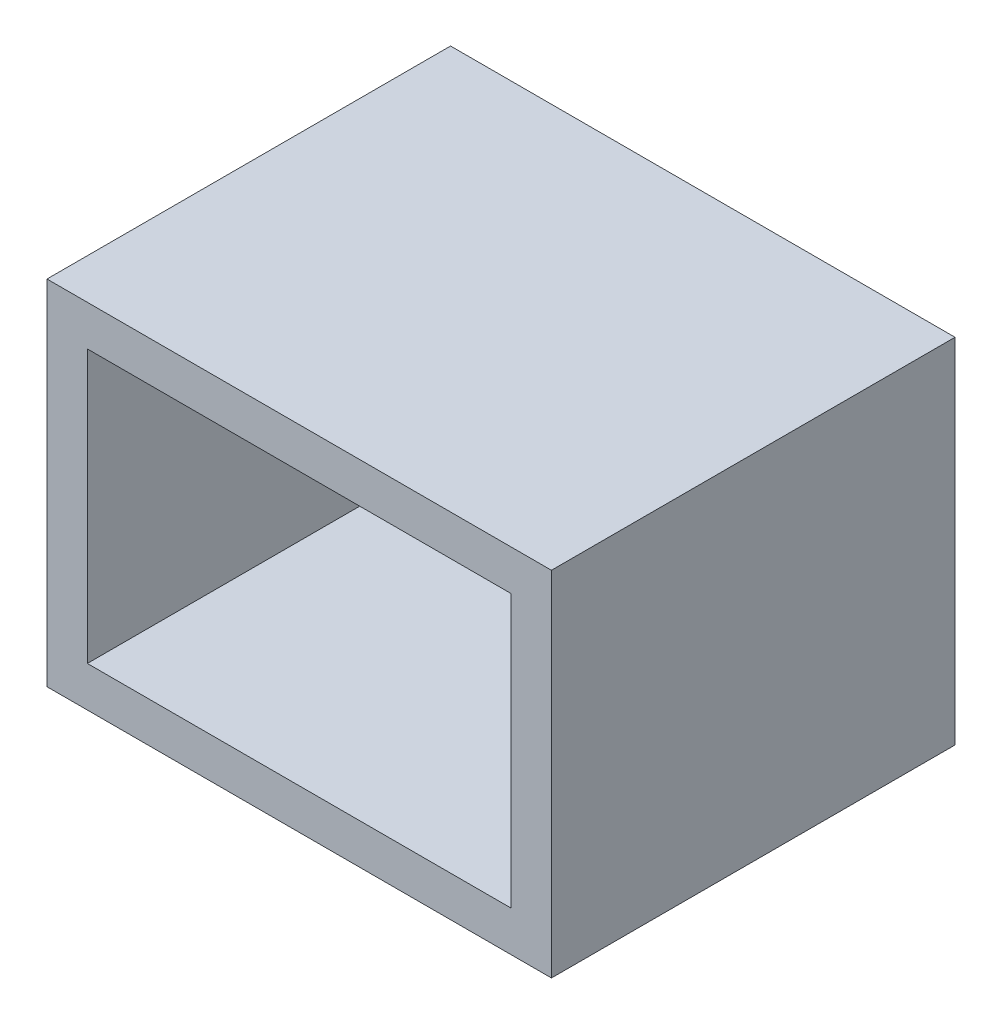
ISO-10303-21;
HEADER;
FILE_DESCRIPTION(('STEP AP214'),'2;1');
FILE_NAME('part.step','',(''),(''),'','','');
FILE_SCHEMA(('AUTOMOTIVE_DESIGN { 1 0 10303 214 1 1 1 1 }'));
ENDSEC;
DATA;
#1=APPLICATION_CONTEXT('core data for automotive mechanical design processes');
#2=APPLICATION_PROTOCOL_DEFINITION('international standard','automotive_design',2000,#1);
#3=PRODUCT_CONTEXT('',#1,'mechanical');
#4=PRODUCT('Part','Part','',(#3));
#5=PRODUCT_RELATED_PRODUCT_CATEGORY('part','',(#4));
#6=PRODUCT_DEFINITION_FORMATION('','',#4);
#7=PRODUCT_DEFINITION_CONTEXT('part definition',#1,'design');
#8=PRODUCT_DEFINITION('design','',#6,#7);
#9=PRODUCT_DEFINITION_SHAPE('','',#8);
#10=(LENGTH_UNIT() NAMED_UNIT(*) SI_UNIT(.MILLI.,.METRE.));
#11=(NAMED_UNIT(*) PLANE_ANGLE_UNIT() SI_UNIT($,.RADIAN.));
#12=(NAMED_UNIT(*) SI_UNIT($,.STERADIAN.) SOLID_ANGLE_UNIT());
#13=UNCERTAINTY_MEASURE_WITH_UNIT(LENGTH_MEASURE(1.E-05),#10,'distance_accuracy_value','');
#14=(GEOMETRIC_REPRESENTATION_CONTEXT(3) GLOBAL_UNCERTAINTY_ASSIGNED_CONTEXT((#13)) GLOBAL_UNIT_ASSIGNED_CONTEXT((#10,
#11,#12)) REPRESENTATION_CONTEXT('',''));
#15=CARTESIAN_POINT('',(0.,0.,0.));
#16=DIRECTION('',(0.,0.,1.));
#17=DIRECTION('',(1.,0.,0.));
#18=AXIS2_PLACEMENT_3D('',#15,#16,#17);
#19=CARTESIAN_POINT('',(25.,35.,-20.));
#20=DIRECTION('',(-1.,0.,0.));
#21=DIRECTION('',(0.,0.,1.));
#22=AXIS2_PLACEMENT_3D('',#19,#20,#21);
#23=PLANE('',#22);
#24=DIRECTION('',(0.,0.,-1.));
#25=VECTOR('',#24,1.);
#26=CARTESIAN_POINT('',(25.,0.,-20.));
#27=LINE('',#26,#25);
#28=CARTESIAN_POINT('',(25.,0.,20.));
#29=VERTEX_POINT('',#28);
#30=CARTESIAN_POINT('',(25.,0.,-20.));
#31=VERTEX_POINT('',#30);
#32=EDGE_CURVE('E134',#29,#31,#27,.T.);
#33=ORIENTED_EDGE('',*,*,#32,.T.);
#34=DIRECTION('',(0.,-1.,0.));
#35=VECTOR('',#34,1.);
#36=CARTESIAN_POINT('',(25.,35.,-20.));
#37=LINE('',#36,#35);
#38=CARTESIAN_POINT('',(25.,35.,-20.));
#39=VERTEX_POINT('',#38);
#40=EDGE_CURVE('E11',#39,#31,#37,.T.);
#41=ORIENTED_EDGE('',*,*,#40,.F.);
#42=DIRECTION('',(0.,0.,-1.));
#43=VECTOR('',#42,1.);
#44=CARTESIAN_POINT('',(25.,35.,-20.));
#45=LINE('',#44,#43);
#46=CARTESIAN_POINT('',(25.,35.,20.));
#47=VERTEX_POINT('',#46);
#48=EDGE_CURVE('E138',#47,#39,#45,.T.);
#49=ORIENTED_EDGE('',*,*,#48,.F.);
#50=DIRECTION('',(0.,-1.,0.));
#51=VECTOR('',#50,1.);
#52=CARTESIAN_POINT('',(25.,35.,20.));
#53=LINE('',#52,#51);
#54=EDGE_CURVE('E148',#47,#29,#53,.T.);
#55=ORIENTED_EDGE('',*,*,#54,.T.);
#56=EDGE_LOOP('',(#33,#41,#49,#55));
#57=FACE_BOUND('',#56,.T.);
#58=ADVANCED_FACE('F37',(#57),#23,.F.);
#59=CARTESIAN_POINT('',(-25.,35.,-20.));
#60=DIRECTION('',(0.,0.,1.));
#61=DIRECTION('',(1.,0.,0.));
#62=AXIS2_PLACEMENT_3D('',#59,#60,#61);
#63=PLANE('',#62);
#64=DIRECTION('',(0.,1.,0.));
#65=VECTOR('',#64,1.);
#66=CARTESIAN_POINT('',(21.,4.,-20.));
#67=LINE('',#66,#65);
#68=CARTESIAN_POINT('',(21.,4.,-20.));
#69=VERTEX_POINT('',#68);
#70=CARTESIAN_POINT('',(21.,31.,-20.));
#71=VERTEX_POINT('',#70);
#72=EDGE_CURVE('E109',#69,#71,#67,.T.);
#73=ORIENTED_EDGE('',*,*,#72,.T.);
#74=DIRECTION('',(-1.,0.,0.));
#75=VECTOR('',#74,1.);
#76=CARTESIAN_POINT('',(21.,31.,-20.));
#77=LINE('',#76,#75);
#78=CARTESIAN_POINT('',(-21.,31.,-20.));
#79=VERTEX_POINT('',#78);
#80=EDGE_CURVE('E103',#71,#79,#77,.T.);
#81=ORIENTED_EDGE('',*,*,#80,.T.);
#82=DIRECTION('',(0.,-1.,0.));
#83=VECTOR('',#82,1.);
#84=CARTESIAN_POINT('',(-21.,31.,-20.));
#85=LINE('',#84,#83);
#86=CARTESIAN_POINT('',(-21.,4.,-20.));
#87=VERTEX_POINT('',#86);
#88=EDGE_CURVE('E112',#79,#87,#85,.T.);
#89=ORIENTED_EDGE('',*,*,#88,.T.);
#90=DIRECTION('',(1.,0.,0.));
#91=VECTOR('',#90,1.);
#92=CARTESIAN_POINT('',(-21.,4.,-20.));
#93=LINE('',#92,#91);
#94=EDGE_CURVE('E51',#87,#69,#93,.T.);
#95=ORIENTED_EDGE('',*,*,#94,.T.);
#96=EDGE_LOOP('',(#73,#81,#89,#95));
#97=FACE_BOUND('',#96,.T.);
#98=DIRECTION('',(-1.,0.,0.));
#99=VECTOR('',#98,1.);
#100=CARTESIAN_POINT('',(-25.,0.,-20.));
#101=LINE('',#100,#99);
#102=CARTESIAN_POINT('',(-25.,0.,-20.));
#103=VERTEX_POINT('',#102);
#104=EDGE_CURVE('E151',#31,#103,#101,.T.);
#105=ORIENTED_EDGE('',*,*,#104,.T.);
#106=DIRECTION('',(0.,-1.,0.));
#107=VECTOR('',#106,1.);
#108=CARTESIAN_POINT('',(-25.,35.,-20.));
#109=LINE('',#108,#107);
#110=CARTESIAN_POINT('',(-25.,35.,-20.));
#111=VERTEX_POINT('',#110);
#112=EDGE_CURVE('E44',#111,#103,#109,.T.);
#113=ORIENTED_EDGE('',*,*,#112,.F.);
#114=DIRECTION('',(-1.,0.,0.));
#115=VECTOR('',#114,1.);
#116=CARTESIAN_POINT('',(-25.,35.,-20.));
#117=LINE('',#116,#115);
#118=EDGE_CURVE('E141',#39,#111,#117,.T.);
#119=ORIENTED_EDGE('',*,*,#118,.F.);
#120=ORIENTED_EDGE('',*,*,#40,.T.);
#121=EDGE_LOOP('',(#105,#113,#119,#120));
#122=FACE_BOUND('',#121,.T.);
#123=ADVANCED_FACE('F116',(#97,#122),#63,.F.);
#124=CARTESIAN_POINT('',(-25.,35.,-20.));
#125=DIRECTION('',(1.,0.,0.));
#126=DIRECTION('',(0.,0.,-1.));
#127=AXIS2_PLACEMENT_3D('',#124,#125,#126);
#128=PLANE('',#127);
#129=DIRECTION('',(0.,0.,1.));
#130=VECTOR('',#129,1.);
#131=CARTESIAN_POINT('',(-25.,0.,-20.));
#132=LINE('',#131,#130);
#133=CARTESIAN_POINT('',(-25.,0.,20.));
#134=VERTEX_POINT('',#133);
#135=EDGE_CURVE('E153',#103,#134,#132,.T.);
#136=ORIENTED_EDGE('',*,*,#135,.T.);
#137=DIRECTION('',(0.,-1.,0.));
#138=VECTOR('',#137,1.);
#139=CARTESIAN_POINT('',(-25.,35.,20.));
#140=LINE('',#139,#138);
#141=CARTESIAN_POINT('',(-25.,35.,20.));
#142=VERTEX_POINT('',#141);
#143=EDGE_CURVE('E158',#142,#134,#140,.T.);
#144=ORIENTED_EDGE('',*,*,#143,.F.);
#145=DIRECTION('',(0.,0.,1.));
#146=VECTOR('',#145,1.);
#147=CARTESIAN_POINT('',(-25.,35.,-20.));
#148=LINE('',#147,#146);
#149=EDGE_CURVE('E144',#111,#142,#148,.T.);
#150=ORIENTED_EDGE('',*,*,#149,.F.);
#151=ORIENTED_EDGE('',*,*,#112,.T.);
#152=EDGE_LOOP('',(#136,#144,#150,#151));
#153=FACE_BOUND('',#152,.T.);
#154=ADVANCED_FACE('F165',(#153),#128,.F.);
#155=CARTESIAN_POINT('',(-25.,35.,20.));
#156=DIRECTION('',(0.,0.,-1.));
#157=DIRECTION('',(-1.,0.,0.));
#158=AXIS2_PLACEMENT_3D('',#155,#156,#157);
#159=PLANE('',#158);
#160=DIRECTION('',(0.,-1.,0.));
#161=VECTOR('',#160,1.);
#162=CARTESIAN_POINT('',(-21.,31.,20.));
#163=LINE('',#162,#161);
#164=CARTESIAN_POINT('',(-21.,31.,20.));
#165=VERTEX_POINT('',#164);
#166=CARTESIAN_POINT('',(-21.,4.,20.));
#167=VERTEX_POINT('',#166);
#168=EDGE_CURVE('E128',#165,#167,#163,.T.);
#169=ORIENTED_EDGE('',*,*,#168,.F.);
#170=DIRECTION('',(-1.,0.,0.));
#171=VECTOR('',#170,1.);
#172=CARTESIAN_POINT('',(21.,31.,20.));
#173=LINE('',#172,#171);
#174=CARTESIAN_POINT('',(21.,31.,20.));
#175=VERTEX_POINT('',#174);
#176=EDGE_CURVE('E59',#175,#165,#173,.T.);
#177=ORIENTED_EDGE('',*,*,#176,.F.);
#178=DIRECTION('',(0.,1.,0.));
#179=VECTOR('',#178,1.);
#180=CARTESIAN_POINT('',(21.,4.,20.));
#181=LINE('',#180,#179);
#182=CARTESIAN_POINT('',(21.,4.,20.));
#183=VERTEX_POINT('',#182);
#184=EDGE_CURVE('E119',#183,#175,#181,.T.);
#185=ORIENTED_EDGE('',*,*,#184,.F.);
#186=DIRECTION('',(1.,0.,0.));
#187=VECTOR('',#186,1.);
#188=CARTESIAN_POINT('',(-21.,4.,20.));
#189=LINE('',#188,#187);
#190=EDGE_CURVE('E122',#167,#183,#189,.T.);
#191=ORIENTED_EDGE('',*,*,#190,.F.);
#192=EDGE_LOOP('',(#169,#177,#185,#191));
#193=FACE_BOUND('',#192,.T.);
#194=DIRECTION('',(1.,0.,0.));
#195=VECTOR('',#194,1.);
#196=CARTESIAN_POINT('',(-25.,0.,20.));
#197=LINE('',#196,#195);
#198=EDGE_CURVE('E142',#134,#29,#197,.T.);
#199=ORIENTED_EDGE('',*,*,#198,.T.);
#200=ORIENTED_EDGE('',*,*,#54,.F.);
#201=DIRECTION('',(1.,0.,0.));
#202=VECTOR('',#201,1.);
#203=CARTESIAN_POINT('',(-25.,35.,20.));
#204=LINE('',#203,#202);
#205=EDGE_CURVE('E146',#142,#47,#204,.T.);
#206=ORIENTED_EDGE('',*,*,#205,.F.);
#207=ORIENTED_EDGE('',*,*,#143,.T.);
#208=EDGE_LOOP('',(#199,#200,#206,#207));
#209=FACE_BOUND('',#208,.T.);
#210=ADVANCED_FACE('F173',(#193,#209),#159,.F.);
#211=CARTESIAN_POINT('',(0.,35.,0.));
#212=DIRECTION('',(0.,1.,0.));
#213=DIRECTION('',(0.,0.,1.));
#214=AXIS2_PLACEMENT_3D('',#211,#212,#213);
#215=PLANE('',#214);
#216=ORIENTED_EDGE('',*,*,#48,.T.);
#217=ORIENTED_EDGE('',*,*,#118,.T.);
#218=ORIENTED_EDGE('',*,*,#149,.T.);
#219=ORIENTED_EDGE('',*,*,#205,.T.);
#220=EDGE_LOOP('',(#216,#217,#218,#219));
#221=FACE_BOUND('',#220,.T.);
#222=ADVANCED_FACE('F179',(#221),#215,.T.);
#223=CARTESIAN_POINT('',(0.,0.,0.));
#224=DIRECTION('',(0.,1.,0.));
#225=DIRECTION('',(0.,0.,1.));
#226=AXIS2_PLACEMENT_3D('',#223,#224,#225);
#227=PLANE('',#226);
#228=ORIENTED_EDGE('',*,*,#32,.F.);
#229=ORIENTED_EDGE('',*,*,#198,.F.);
#230=ORIENTED_EDGE('',*,*,#135,.F.);
#231=ORIENTED_EDGE('',*,*,#104,.F.);
#232=EDGE_LOOP('',(#228,#229,#230,#231));
#233=FACE_BOUND('',#232,.T.);
#234=ADVANCED_FACE('F170',(#233),#227,.F.);
#235=CARTESIAN_POINT('',(21.,31.,-20.));
#236=DIRECTION('',(0.,1.,0.));
#237=DIRECTION('',(-1.,0.,0.));
#238=AXIS2_PLACEMENT_3D('',#235,#236,#237);
#239=PLANE('',#238);
#240=ORIENTED_EDGE('',*,*,#176,.T.);
#241=DIRECTION('',(0.,0.,1.));
#242=VECTOR('',#241,1.);
#243=CARTESIAN_POINT('',(-21.,31.,-20.));
#244=LINE('',#243,#242);
#245=EDGE_CURVE('E99',#79,#165,#244,.T.);
#246=ORIENTED_EDGE('',*,*,#245,.F.);
#247=ORIENTED_EDGE('',*,*,#80,.F.);
#248=DIRECTION('',(0.,0.,1.));
#249=VECTOR('',#248,1.);
#250=CARTESIAN_POINT('',(21.,31.,-20.));
#251=LINE('',#250,#249);
#252=EDGE_CURVE('E132',#71,#175,#251,.T.);
#253=ORIENTED_EDGE('',*,*,#252,.T.);
#254=EDGE_LOOP('',(#240,#246,#247,#253));
#255=FACE_BOUND('',#254,.T.);
#256=ADVANCED_FACE('F101',(#255),#239,.F.);
#257=CARTESIAN_POINT('',(21.,4.,-20.));
#258=DIRECTION('',(1.,0.,0.));
#259=DIRECTION('',(0.,1.,0.));
#260=AXIS2_PLACEMENT_3D('',#257,#258,#259);
#261=PLANE('',#260);
#262=ORIENTED_EDGE('',*,*,#184,.T.);
#263=ORIENTED_EDGE('',*,*,#252,.F.);
#264=ORIENTED_EDGE('',*,*,#72,.F.);
#265=DIRECTION('',(0.,0.,1.));
#266=VECTOR('',#265,1.);
#267=CARTESIAN_POINT('',(21.,4.,-20.));
#268=LINE('',#267,#266);
#269=EDGE_CURVE('E135',#69,#183,#268,.T.);
#270=ORIENTED_EDGE('',*,*,#269,.T.);
#271=EDGE_LOOP('',(#262,#263,#264,#270));
#272=FACE_BOUND('',#271,.T.);
#273=ADVANCED_FACE('F196',(#272),#261,.F.);
#274=CARTESIAN_POINT('',(-21.,4.,-20.));
#275=DIRECTION('',(0.,-1.,0.));
#276=DIRECTION('',(0.,0.,-1.));
#277=AXIS2_PLACEMENT_3D('',#274,#275,#276);
#278=PLANE('',#277);
#279=ORIENTED_EDGE('',*,*,#190,.T.);
#280=ORIENTED_EDGE('',*,*,#269,.F.);
#281=ORIENTED_EDGE('',*,*,#94,.F.);
#282=DIRECTION('',(0.,0.,1.));
#283=VECTOR('',#282,1.);
#284=CARTESIAN_POINT('',(-21.,4.,-20.));
#285=LINE('',#284,#283);
#286=EDGE_CURVE('E108',#87,#167,#285,.T.);
#287=ORIENTED_EDGE('',*,*,#286,.T.);
#288=EDGE_LOOP('',(#279,#280,#281,#287));
#289=FACE_BOUND('',#288,.T.);
#290=ADVANCED_FACE('F199',(#289),#278,.F.);
#291=CARTESIAN_POINT('',(-21.,31.,-20.));
#292=DIRECTION('',(-1.,0.,0.));
#293=DIRECTION('',(0.,-1.,0.));
#294=AXIS2_PLACEMENT_3D('',#291,#292,#293);
#295=PLANE('',#294);
#296=ORIENTED_EDGE('',*,*,#168,.T.);
#297=ORIENTED_EDGE('',*,*,#286,.F.);
#298=ORIENTED_EDGE('',*,*,#88,.F.);
#299=ORIENTED_EDGE('',*,*,#245,.T.);
#300=EDGE_LOOP('',(#296,#297,#298,#299));
#301=FACE_BOUND('',#300,.T.);
#302=ADVANCED_FACE('F113',(#301),#295,.F.);
#303=CLOSED_SHELL('',(#58,#123,#154,#210,#222,#234,#256,#273,#290,#302));
#304=MANIFOLD_SOLID_BREP('B2',#303);
#305=ADVANCED_BREP_SHAPE_REPRESENTATION('',(#18,#304),#14);
#306=SHAPE_DEFINITION_REPRESENTATION(#9,#305);
ENDSEC;
END-ISO-10303-21;
